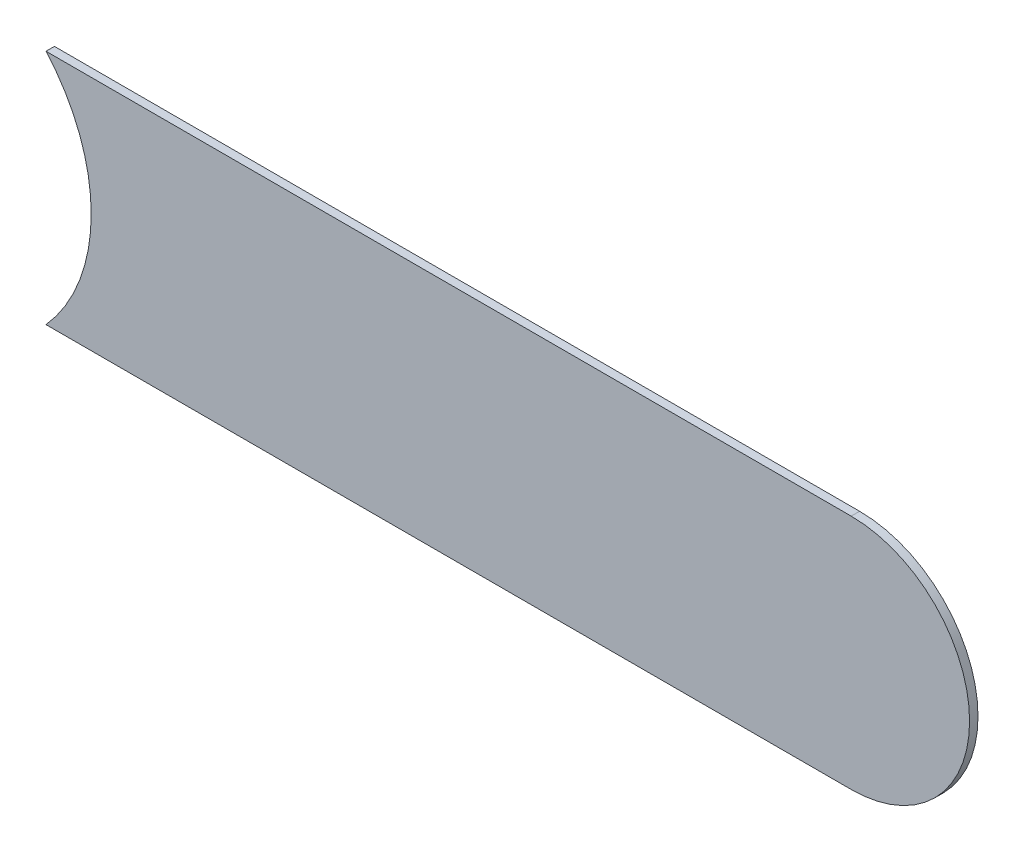
ISO-10303-21;
HEADER;
FILE_DESCRIPTION(('STEP AP214'),'2;1');
FILE_NAME('part.step','',(''),(''),'','','');
FILE_SCHEMA(('AUTOMOTIVE_DESIGN { 1 0 10303 214 1 1 1 1 }'));
ENDSEC;
DATA;
#1=APPLICATION_CONTEXT('core data for automotive mechanical design processes');
#2=APPLICATION_PROTOCOL_DEFINITION('international standard','automotive_design',2000,#1);
#3=PRODUCT_CONTEXT('',#1,'mechanical');
#4=PRODUCT('Part','Part','',(#3));
#5=PRODUCT_RELATED_PRODUCT_CATEGORY('part','',(#4));
#6=PRODUCT_DEFINITION_FORMATION('','',#4);
#7=PRODUCT_DEFINITION_CONTEXT('part definition',#1,'design');
#8=PRODUCT_DEFINITION('design','',#6,#7);
#9=PRODUCT_DEFINITION_SHAPE('','',#8);
#10=(LENGTH_UNIT() NAMED_UNIT(*) SI_UNIT(.MILLI.,.METRE.));
#11=(NAMED_UNIT(*) PLANE_ANGLE_UNIT() SI_UNIT($,.RADIAN.));
#12=(NAMED_UNIT(*) SI_UNIT($,.STERADIAN.) SOLID_ANGLE_UNIT());
#13=UNCERTAINTY_MEASURE_WITH_UNIT(LENGTH_MEASURE(1.E-05),#10,'distance_accuracy_value','');
#14=(GEOMETRIC_REPRESENTATION_CONTEXT(3) GLOBAL_UNCERTAINTY_ASSIGNED_CONTEXT((#13)) GLOBAL_UNIT_ASSIGNED_CONTEXT((#10,
#11,#12)) REPRESENTATION_CONTEXT('',''));
#15=CARTESIAN_POINT('',(0.,0.,0.));
#16=DIRECTION('',(0.,0.,1.));
#17=DIRECTION('',(1.,0.,0.));
#18=AXIS2_PLACEMENT_3D('',#15,#16,#17);
#19=CARTESIAN_POINT('',(83.459027876341,41.9999922,0.));
#20=DIRECTION('',(0.,1.,0.));
#21=DIRECTION('',(1.,0.,0.));
#22=AXIS2_PLACEMENT_3D('',#19,#20,#21);
#23=PLANE('',#22);
#24=DIRECTION('',(1.,0.,0.));
#25=VECTOR('',#24,1.);
#26=CARTESIAN_POINT('',(82.900012,41.9999922,0.03556));
#27=LINE('',#26,#25);
#28=CARTESIAN_POINT('',(83.459027876341,41.9999922,0.03556));
#29=VERTEX_POINT('',#28);
#30=CARTESIAN_POINT('',(86.8599736,41.9999922,0.03556));
#31=VERTEX_POINT('',#30);
#32=EDGE_CURVE('E11',#29,#31,#27,.T.);
#33=ORIENTED_EDGE('',*,*,#32,.F.);
#34=DIRECTION('',(0.,0.,1.));
#35=VECTOR('',#34,1.);
#36=CARTESIAN_POINT('',(83.459027876341,41.9999922,0.));
#37=LINE('',#36,#35);
#38=CARTESIAN_POINT('',(83.459027876341,41.9999922,0.));
#39=VERTEX_POINT('',#38);
#40=EDGE_CURVE('E24',#39,#29,#37,.T.);
#41=ORIENTED_EDGE('',*,*,#40,.F.);
#42=DIRECTION('',(1.,0.,0.));
#43=VECTOR('',#42,1.);
#44=CARTESIAN_POINT('',(82.900012,41.9999922,0.));
#45=LINE('',#44,#43);
#46=CARTESIAN_POINT('',(86.8599736,41.9999922,0.));
#47=VERTEX_POINT('',#46);
#48=EDGE_CURVE('E82',#39,#47,#45,.T.);
#49=ORIENTED_EDGE('',*,*,#48,.T.);
#50=DIRECTION('',(0.,0.,1.));
#51=VECTOR('',#50,1.);
#52=CARTESIAN_POINT('',(86.8599736,41.9999922,0.));
#53=LINE('',#52,#51);
#54=EDGE_CURVE('E37',#47,#31,#53,.T.);
#55=ORIENTED_EDGE('',*,*,#54,.T.);
#56=EDGE_LOOP('',(#33,#41,#49,#55));
#57=FACE_BOUND('',#56,.T.);
#58=ADVANCED_FACE('F17',(#57),#23,.F.);
#59=CARTESIAN_POINT('',(86.8599736,42.4999912,0.));
#60=DIRECTION('',(0.,0.,-1.));
#61=DIRECTION('',(0.,-1.,0.));
#62=AXIS2_PLACEMENT_3D('',#59,#60,#61);
#63=CYLINDRICAL_SURFACE('',#62,0.499999000000002);
#64=CARTESIAN_POINT('',(86.8599736,42.4999912,0.03556));
#65=DIRECTION('',(0.,0.,1.));
#66=DIRECTION('',(0.,-1.,0.));
#67=AXIS2_PLACEMENT_3D('',#64,#65,#66);
#68=CIRCLE('',#67,0.499999000000002);
#69=CARTESIAN_POINT('',(86.8599736,42.9999902,0.03556));
#70=VERTEX_POINT('',#69);
#71=EDGE_CURVE('E97',#31,#70,#68,.T.);
#72=ORIENTED_EDGE('',*,*,#71,.F.);
#73=ORIENTED_EDGE('',*,*,#54,.F.);
#74=CARTESIAN_POINT('',(86.8599736,42.4999912,0.));
#75=DIRECTION('',(0.,0.,1.));
#76=DIRECTION('',(0.,-1.,0.));
#77=AXIS2_PLACEMENT_3D('',#74,#75,#76);
#78=CIRCLE('',#77,0.499999000000002);
#79=CARTESIAN_POINT('',(86.8599736,42.9999902,0.));
#80=VERTEX_POINT('',#79);
#81=EDGE_CURVE('E94',#47,#80,#78,.T.);
#82=ORIENTED_EDGE('',*,*,#81,.T.);
#83=DIRECTION('',(0.,0.,1.));
#84=VECTOR('',#83,1.);
#85=CARTESIAN_POINT('',(86.8599736,42.9999902,0.));
#86=LINE('',#85,#84);
#87=EDGE_CURVE('E92',#80,#70,#86,.T.);
#88=ORIENTED_EDGE('',*,*,#87,.T.);
#89=EDGE_LOOP('',(#72,#73,#82,#88));
#90=FACE_BOUND('',#89,.T.);
#91=ADVANCED_FACE('F103',(#90),#63,.T.);
#92=CARTESIAN_POINT('',(86.8599736,42.9999902,0.));
#93=DIRECTION('',(0.,-1.,0.));
#94=DIRECTION('',(-1.,0.,0.));
#95=AXIS2_PLACEMENT_3D('',#92,#93,#94);
#96=PLANE('',#95);
#97=DIRECTION('',(-1.,0.,0.));
#98=VECTOR('',#97,1.);
#99=CARTESIAN_POINT('',(86.8599736,42.9999902,0.03556));
#100=LINE('',#99,#98);
#101=CARTESIAN_POINT('',(83.459027876341,42.9999902,0.03556));
#102=VERTEX_POINT('',#101);
#103=EDGE_CURVE('E89',#70,#102,#100,.T.);
#104=ORIENTED_EDGE('',*,*,#103,.F.);
#105=ORIENTED_EDGE('',*,*,#87,.F.);
#106=DIRECTION('',(-1.,0.,0.));
#107=VECTOR('',#106,1.);
#108=CARTESIAN_POINT('',(86.8599736,42.9999902,0.));
#109=LINE('',#108,#107);
#110=CARTESIAN_POINT('',(83.459027876341,42.9999902,0.));
#111=VERTEX_POINT('',#110);
#112=EDGE_CURVE('E87',#80,#111,#109,.T.);
#113=ORIENTED_EDGE('',*,*,#112,.T.);
#114=DIRECTION('',(0.,0.,1.));
#115=VECTOR('',#114,1.);
#116=CARTESIAN_POINT('',(83.459027876341,42.9999902,0.));
#117=LINE('',#116,#115);
#118=EDGE_CURVE('E69',#111,#102,#117,.T.);
#119=ORIENTED_EDGE('',*,*,#118,.T.);
#120=EDGE_LOOP('',(#104,#105,#113,#119));
#121=FACE_BOUND('',#120,.T.);
#122=ADVANCED_FACE('F108',(#121),#96,.F.);
#123=CARTESIAN_POINT('',(82.900012,42.4999912,0.));
#124=DIRECTION('',(0.,0.,-1.));
#125=DIRECTION('',(1.,0.,0.));
#126=AXIS2_PLACEMENT_3D('',#123,#124,#125);
#127=CYLINDRICAL_SURFACE('',#126,0.7499985);
#128=DIRECTION('',(0.,0.,1.));
#129=VECTOR('',#128,1.);
#130=CARTESIAN_POINT('',(83.6500105,42.4999912,0.));
#131=LINE('',#130,#129);
#132=CARTESIAN_POINT('',(83.6500105,42.4999912,0.));
#133=VERTEX_POINT('',#132);
#134=CARTESIAN_POINT('',(83.6500105,42.4999912,0.03556));
#135=VERTEX_POINT('',#134);
#136=EDGE_CURVE('E59',#133,#135,#131,.T.);
#137=ORIENTED_EDGE('',*,*,#136,.T.);
#138=CARTESIAN_POINT('',(82.900012,42.4999912,0.03556));
#139=DIRECTION('',(0.,0.,1.));
#140=DIRECTION('',(1.,0.,0.));
#141=AXIS2_PLACEMENT_3D('',#138,#139,#140);
#142=CIRCLE('',#141,0.7499985);
#143=EDGE_CURVE('E70',#135,#102,#142,.T.);
#144=ORIENTED_EDGE('',*,*,#143,.T.);
#145=ORIENTED_EDGE('',*,*,#118,.F.);
#146=CARTESIAN_POINT('',(82.900012,42.4999912,0.));
#147=DIRECTION('',(0.,0.,1.));
#148=DIRECTION('',(1.,0.,0.));
#149=AXIS2_PLACEMENT_3D('',#146,#147,#148);
#150=CIRCLE('',#149,0.7499985);
#151=EDGE_CURVE('E73',#133,#111,#150,.T.);
#152=ORIENTED_EDGE('',*,*,#151,.F.);
#153=EDGE_LOOP('',(#137,#144,#145,#152));
#154=FACE_BOUND('',#153,.T.);
#155=ADVANCED_FACE('F74',(#154),#127,.F.);
#156=CARTESIAN_POINT('',(82.900012,42.4999912,0.));
#157=DIRECTION('',(0.,0.,-1.));
#158=DIRECTION('',(1.,0.,0.));
#159=AXIS2_PLACEMENT_3D('',#156,#157,#158);
#160=CYLINDRICAL_SURFACE('',#159,0.7499985);
#161=ORIENTED_EDGE('',*,*,#40,.T.);
#162=CARTESIAN_POINT('',(82.900012,42.4999912,0.03556));
#163=DIRECTION('',(0.,0.,1.));
#164=DIRECTION('',(1.,0.,0.));
#165=AXIS2_PLACEMENT_3D('',#162,#163,#164);
#166=CIRCLE('',#165,0.7499985);
#167=EDGE_CURVE('E65',#29,#135,#166,.T.);
#168=ORIENTED_EDGE('',*,*,#167,.T.);
#169=ORIENTED_EDGE('',*,*,#136,.F.);
#170=EDGE_CURVE('E63',#39,#133,#150,.T.);
#171=ORIENTED_EDGE('',*,*,#170,.F.);
#172=EDGE_LOOP('',(#161,#168,#169,#171));
#173=FACE_BOUND('',#172,.T.);
#174=ADVANCED_FACE('F61',(#173),#160,.F.);
#175=CARTESIAN_POINT('',(82.900012,41.9999922,0.));
#176=DIRECTION('',(0.,0.,-1.));
#177=DIRECTION('',(-1.,0.,0.));
#178=AXIS2_PLACEMENT_3D('',#175,#176,#177);
#179=PLANE('',#178);
#180=ORIENTED_EDGE('',*,*,#48,.F.);
#181=ORIENTED_EDGE('',*,*,#170,.T.);
#182=ORIENTED_EDGE('',*,*,#151,.T.);
#183=ORIENTED_EDGE('',*,*,#112,.F.);
#184=ORIENTED_EDGE('',*,*,#81,.F.);
#185=EDGE_LOOP('',(#180,#181,#182,#183,#184));
#186=FACE_BOUND('',#185,.T.);
#187=ADVANCED_FACE('F80',(#186),#179,.T.);
#188=CARTESIAN_POINT('',(82.900012,41.9999922,0.03556));
#189=DIRECTION('',(0.,0.,-1.));
#190=DIRECTION('',(-1.,0.,0.));
#191=AXIS2_PLACEMENT_3D('',#188,#189,#190);
#192=PLANE('',#191);
#193=ORIENTED_EDGE('',*,*,#167,.F.);
#194=ORIENTED_EDGE('',*,*,#32,.T.);
#195=ORIENTED_EDGE('',*,*,#71,.T.);
#196=ORIENTED_EDGE('',*,*,#103,.T.);
#197=ORIENTED_EDGE('',*,*,#143,.F.);
#198=EDGE_LOOP('',(#193,#194,#195,#196,#197));
#199=FACE_BOUND('',#198,.T.);
#200=ADVANCED_FACE('F106',(#199),#192,.F.);
#201=CLOSED_SHELL('',(#58,#91,#122,#155,#174,#187,#200));
#202=MANIFOLD_SOLID_BREP('B1',#201);
#203=ADVANCED_BREP_SHAPE_REPRESENTATION('',(#18,#202),#14);
#204=SHAPE_DEFINITION_REPRESENTATION(#9,#203);
ENDSEC;
END-ISO-10303-21;
